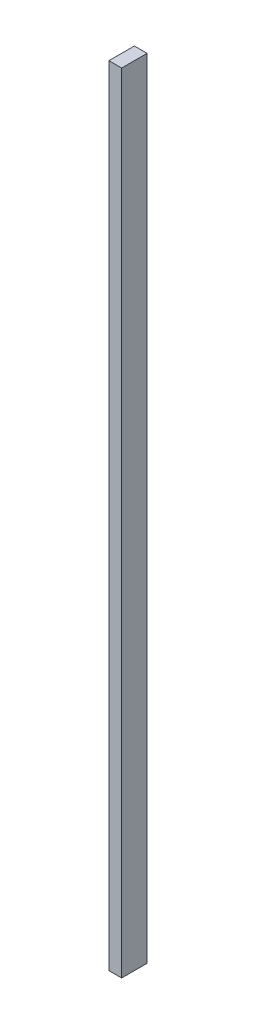
ISO-10303-21;
HEADER;
FILE_DESCRIPTION(('STEP AP214'),'2;1');
FILE_NAME('part.step','',(''),(''),'','','');
FILE_SCHEMA(('AUTOMOTIVE_DESIGN { 1 0 10303 214 1 1 1 1 }'));
ENDSEC;
DATA;
#1=APPLICATION_CONTEXT('core data for automotive mechanical design processes');
#2=APPLICATION_PROTOCOL_DEFINITION('international standard','automotive_design',2000,#1);
#3=PRODUCT_CONTEXT('',#1,'mechanical');
#4=PRODUCT('Part','Part','',(#3));
#5=PRODUCT_RELATED_PRODUCT_CATEGORY('part','',(#4));
#6=PRODUCT_DEFINITION_FORMATION('','',#4);
#7=PRODUCT_DEFINITION_CONTEXT('part definition',#1,'design');
#8=PRODUCT_DEFINITION('design','',#6,#7);
#9=PRODUCT_DEFINITION_SHAPE('','',#8);
#10=(LENGTH_UNIT() NAMED_UNIT(*) SI_UNIT(.MILLI.,.METRE.));
#11=(NAMED_UNIT(*) PLANE_ANGLE_UNIT() SI_UNIT($,.RADIAN.));
#12=(NAMED_UNIT(*) SI_UNIT($,.STERADIAN.) SOLID_ANGLE_UNIT());
#13=UNCERTAINTY_MEASURE_WITH_UNIT(LENGTH_MEASURE(1.E-05),#10,'distance_accuracy_value','');
#14=(GEOMETRIC_REPRESENTATION_CONTEXT(3) GLOBAL_UNCERTAINTY_ASSIGNED_CONTEXT((#13)) GLOBAL_UNIT_ASSIGNED_CONTEXT((#10,
#11,#12)) REPRESENTATION_CONTEXT('',''));
#15=CARTESIAN_POINT('',(0.,0.,0.));
#16=DIRECTION('',(0.,0.,1.));
#17=DIRECTION('',(1.,0.,0.));
#18=AXIS2_PLACEMENT_3D('',#15,#16,#17);
#19=CARTESIAN_POINT('',(-12.5,1550.,-25.));
#20=DIRECTION('',(1.,0.,0.));
#21=DIRECTION('',(0.,0.,-1.));
#22=AXIS2_PLACEMENT_3D('',#19,#20,#21);
#23=PLANE('',#22);
#24=DIRECTION('',(0.,0.,1.));
#25=VECTOR('',#24,1.);
#26=CARTESIAN_POINT('',(-12.5,0.,-25.));
#27=LINE('',#26,#25);
#28=CARTESIAN_POINT('',(-12.5,0.,-25.));
#29=VERTEX_POINT('',#28);
#30=CARTESIAN_POINT('',(-12.5,0.,25.));
#31=VERTEX_POINT('',#30);
#32=EDGE_CURVE('E111',#29,#31,#27,.T.);
#33=ORIENTED_EDGE('',*,*,#32,.T.);
#34=DIRECTION('',(0.,-1.,0.));
#35=VECTOR('',#34,1.);
#36=CARTESIAN_POINT('',(-12.5,1550.,25.));
#37=LINE('',#36,#35);
#38=CARTESIAN_POINT('',(-12.5,1550.,25.));
#39=VERTEX_POINT('',#38);
#40=EDGE_CURVE('E11',#39,#31,#37,.T.);
#41=ORIENTED_EDGE('',*,*,#40,.F.);
#42=DIRECTION('',(0.,0.,1.));
#43=VECTOR('',#42,1.);
#44=CARTESIAN_POINT('',(-12.5,1550.,-25.));
#45=LINE('',#44,#43);
#46=CARTESIAN_POINT('',(-12.5,1550.,-25.));
#47=VERTEX_POINT('',#46);
#48=EDGE_CURVE('E95',#47,#39,#45,.T.);
#49=ORIENTED_EDGE('',*,*,#48,.F.);
#50=DIRECTION('',(0.,-1.,0.));
#51=VECTOR('',#50,1.);
#52=CARTESIAN_POINT('',(-12.5,1550.,-25.));
#53=LINE('',#52,#51);
#54=EDGE_CURVE('E107',#47,#29,#53,.T.);
#55=ORIENTED_EDGE('',*,*,#54,.T.);
#56=EDGE_LOOP('',(#33,#41,#49,#55));
#57=FACE_BOUND('',#56,.T.);
#58=ADVANCED_FACE('F43',(#57),#23,.F.);
#59=CARTESIAN_POINT('',(12.5,1550.,25.));
#60=DIRECTION('',(0.,0.,-1.));
#61=DIRECTION('',(-1.,0.,0.));
#62=AXIS2_PLACEMENT_3D('',#59,#60,#61);
#63=PLANE('',#62);
#64=DIRECTION('',(1.,0.,0.));
#65=VECTOR('',#64,1.);
#66=CARTESIAN_POINT('',(12.5,0.,25.));
#67=LINE('',#66,#65);
#68=CARTESIAN_POINT('',(12.5,0.,25.));
#69=VERTEX_POINT('',#68);
#70=EDGE_CURVE('E100',#31,#69,#67,.T.);
#71=ORIENTED_EDGE('',*,*,#70,.T.);
#72=DIRECTION('',(0.,-1.,0.));
#73=VECTOR('',#72,1.);
#74=CARTESIAN_POINT('',(12.5,1550.,25.));
#75=LINE('',#74,#73);
#76=CARTESIAN_POINT('',(12.5,1550.,25.));
#77=VERTEX_POINT('',#76);
#78=EDGE_CURVE('E52',#77,#69,#75,.T.);
#79=ORIENTED_EDGE('',*,*,#78,.F.);
#80=DIRECTION('',(1.,0.,0.));
#81=VECTOR('',#80,1.);
#82=CARTESIAN_POINT('',(12.5,1550.,25.));
#83=LINE('',#82,#81);
#84=EDGE_CURVE('E90',#39,#77,#83,.T.);
#85=ORIENTED_EDGE('',*,*,#84,.F.);
#86=ORIENTED_EDGE('',*,*,#40,.T.);
#87=EDGE_LOOP('',(#71,#79,#85,#86));
#88=FACE_BOUND('',#87,.T.);
#89=ADVANCED_FACE('F99',(#88),#63,.F.);
#90=CARTESIAN_POINT('',(12.5,1550.,-25.));
#91=DIRECTION('',(-1.,0.,0.));
#92=DIRECTION('',(0.,0.,1.));
#93=AXIS2_PLACEMENT_3D('',#90,#91,#92);
#94=PLANE('',#93);
#95=DIRECTION('',(0.,0.,-1.));
#96=VECTOR('',#95,1.);
#97=CARTESIAN_POINT('',(12.5,0.,-25.));
#98=LINE('',#97,#96);
#99=CARTESIAN_POINT('',(12.5,0.,-25.));
#100=VERTEX_POINT('',#99);
#101=EDGE_CURVE('E77',#69,#100,#98,.T.);
#102=ORIENTED_EDGE('',*,*,#101,.T.);
#103=DIRECTION('',(0.,-1.,0.));
#104=VECTOR('',#103,1.);
#105=CARTESIAN_POINT('',(12.5,1550.,-25.));
#106=LINE('',#105,#104);
#107=CARTESIAN_POINT('',(12.5,1550.,-25.));
#108=VERTEX_POINT('',#107);
#109=EDGE_CURVE('E102',#108,#100,#106,.T.);
#110=ORIENTED_EDGE('',*,*,#109,.F.);
#111=DIRECTION('',(0.,0.,-1.));
#112=VECTOR('',#111,1.);
#113=CARTESIAN_POINT('',(12.5,1550.,-25.));
#114=LINE('',#113,#112);
#115=EDGE_CURVE('E93',#77,#108,#114,.T.);
#116=ORIENTED_EDGE('',*,*,#115,.F.);
#117=ORIENTED_EDGE('',*,*,#78,.T.);
#118=EDGE_LOOP('',(#102,#110,#116,#117));
#119=FACE_BOUND('',#118,.T.);
#120=ADVANCED_FACE('F103',(#119),#94,.F.);
#121=CARTESIAN_POINT('',(12.5,1550.,-25.));
#122=DIRECTION('',(0.,0.,1.));
#123=DIRECTION('',(1.,0.,0.));
#124=AXIS2_PLACEMENT_3D('',#121,#122,#123);
#125=PLANE('',#124);
#126=DIRECTION('',(-1.,0.,0.));
#127=VECTOR('',#126,1.);
#128=CARTESIAN_POINT('',(12.5,0.,-25.));
#129=LINE('',#128,#127);
#130=EDGE_CURVE('E83',#100,#29,#129,.T.);
#131=ORIENTED_EDGE('',*,*,#130,.T.);
#132=ORIENTED_EDGE('',*,*,#54,.F.);
#133=DIRECTION('',(-1.,0.,0.));
#134=VECTOR('',#133,1.);
#135=CARTESIAN_POINT('',(12.5,1550.,-25.));
#136=LINE('',#135,#134);
#137=EDGE_CURVE('E60',#108,#47,#136,.T.);
#138=ORIENTED_EDGE('',*,*,#137,.F.);
#139=ORIENTED_EDGE('',*,*,#109,.T.);
#140=EDGE_LOOP('',(#131,#132,#138,#139));
#141=FACE_BOUND('',#140,.T.);
#142=ADVANCED_FACE('F124',(#141),#125,.F.);
#143=CARTESIAN_POINT('',(0.,1550.,0.));
#144=DIRECTION('',(0.,-1.,0.));
#145=DIRECTION('',(0.,0.,-1.));
#146=AXIS2_PLACEMENT_3D('',#143,#144,#145);
#147=PLANE('',#146);
#148=ORIENTED_EDGE('',*,*,#48,.T.);
#149=ORIENTED_EDGE('',*,*,#84,.T.);
#150=ORIENTED_EDGE('',*,*,#115,.T.);
#151=ORIENTED_EDGE('',*,*,#137,.T.);
#152=EDGE_LOOP('',(#148,#149,#150,#151));
#153=FACE_BOUND('',#152,.T.);
#154=ADVANCED_FACE('F91',(#153),#147,.F.);
#155=CARTESIAN_POINT('',(0.,0.,0.));
#156=DIRECTION('',(0.,-1.,0.));
#157=DIRECTION('',(0.,0.,-1.));
#158=AXIS2_PLACEMENT_3D('',#155,#156,#157);
#159=PLANE('',#158);
#160=ORIENTED_EDGE('',*,*,#32,.F.);
#161=ORIENTED_EDGE('',*,*,#130,.F.);
#162=ORIENTED_EDGE('',*,*,#101,.F.);
#163=ORIENTED_EDGE('',*,*,#70,.F.);
#164=EDGE_LOOP('',(#160,#161,#162,#163));
#165=FACE_BOUND('',#164,.T.);
#166=ADVANCED_FACE('F127',(#165),#159,.T.);
#167=CLOSED_SHELL('',(#58,#89,#120,#142,#154,#166));
#168=MANIFOLD_SOLID_BREP('B2',#167);
#169=ADVANCED_BREP_SHAPE_REPRESENTATION('',(#18,#168),#14);
#170=SHAPE_DEFINITION_REPRESENTATION(#9,#169);
ENDSEC;
END-ISO-10303-21;
